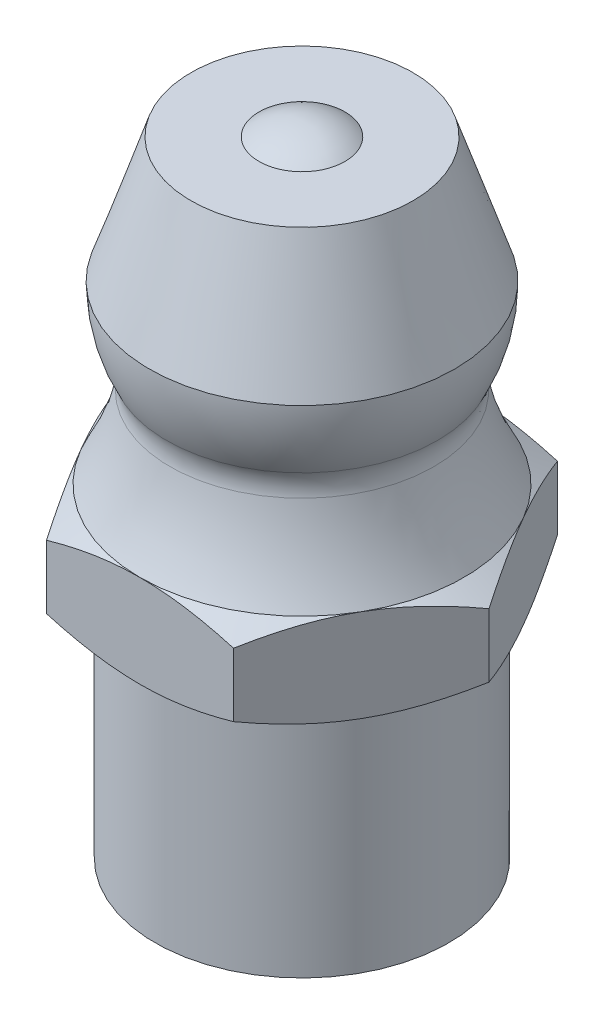
ISO-10303-21;
HEADER;
FILE_DESCRIPTION(('STEP AP214'),'2;1');
FILE_NAME('part.step','',(''),(''),'','','');
FILE_SCHEMA(('AUTOMOTIVE_DESIGN { 1 0 10303 214 1 1 1 1 }'));
ENDSEC;
DATA;
#1=APPLICATION_CONTEXT('core data for automotive mechanical design processes');
#2=APPLICATION_PROTOCOL_DEFINITION('international standard','automotive_design',2000,#1);
#3=PRODUCT_CONTEXT('',#1,'mechanical');
#4=PRODUCT('Part','Part','',(#3));
#5=PRODUCT_RELATED_PRODUCT_CATEGORY('part','',(#4));
#6=PRODUCT_DEFINITION_FORMATION('','',#4);
#7=PRODUCT_DEFINITION_CONTEXT('part definition',#1,'design');
#8=PRODUCT_DEFINITION('design','',#6,#7);
#9=PRODUCT_DEFINITION_SHAPE('','',#8);
#10=(LENGTH_UNIT() NAMED_UNIT(*) SI_UNIT(.MILLI.,.METRE.));
#11=(NAMED_UNIT(*) PLANE_ANGLE_UNIT() SI_UNIT($,.RADIAN.));
#12=(NAMED_UNIT(*) SI_UNIT($,.STERADIAN.) SOLID_ANGLE_UNIT());
#13=UNCERTAINTY_MEASURE_WITH_UNIT(LENGTH_MEASURE(1.E-05),#10,'distance_accuracy_value','');
#14=(GEOMETRIC_REPRESENTATION_CONTEXT(3) GLOBAL_UNCERTAINTY_ASSIGNED_CONTEXT((#13)) GLOBAL_UNIT_ASSIGNED_CONTEXT((#10,
#11,#12)) REPRESENTATION_CONTEXT('',''));
#15=CARTESIAN_POINT('',(0.,0.,0.));
#16=DIRECTION('',(0.,0.,1.));
#17=DIRECTION('',(1.,0.,0.));
#18=AXIS2_PLACEMENT_3D('',#15,#16,#17);
#19=CARTESIAN_POINT('',(0.,56.8,5.));
#20=DIRECTION('',(0.,1.,0.));
#21=DIRECTION('',(0.866025403784439,0.,-0.5));
#22=AXIS2_PLACEMENT_3D('',#19,#20,#21);
#23=PLANE('',#22);
#24=CARTESIAN_POINT('',(0.,56.8,5.));
#25=DIRECTION('',(0.,1.,0.));
#26=DIRECTION('',(0.866025403784439,0.,-0.5));
#27=AXIS2_PLACEMENT_3D('',#24,#25,#26);
#28=CIRCLE('',#27,3.175);
#29=CARTESIAN_POINT('',(-2.7496306570156,56.8,6.5875));
#30=VERTEX_POINT('',#29);
#31=EDGE_CURVE('E218',#30,#30,#28,.T.);
#32=ORIENTED_EDGE('',*,*,#31,.T.);
#33=EDGE_LOOP('',(#32));
#34=FACE_BOUND('',#33,.T.);
#35=CARTESIAN_POINT('',(0.,56.8,5.));
#36=DIRECTION('',(0.,-1.,0.));
#37=DIRECTION('',(-0.866025403784439,0.,0.5));
#38=AXIS2_PLACEMENT_3D('',#35,#36,#37);
#39=CIRCLE('',#38,3.5);
#40=CARTESIAN_POINT('',(0.,56.8,8.5));
#41=VERTEX_POINT('',#40);
#42=CARTESIAN_POINT('',(-3.03108891324554,56.8,6.75));
#43=VERTEX_POINT('',#42);
#44=EDGE_CURVE('E424',#41,#43,#39,.T.);
#45=ORIENTED_EDGE('',*,*,#44,.T.);
#46=CARTESIAN_POINT('',(0.,56.8,5.));
#47=DIRECTION('',(0.,-1.,0.));
#48=DIRECTION('',(-0.866025403784439,0.,0.5));
#49=AXIS2_PLACEMENT_3D('',#46,#47,#48);
#50=CIRCLE('',#49,3.5);
#51=CARTESIAN_POINT('',(-3.03108891324554,56.8,3.25));
#52=VERTEX_POINT('',#51);
#53=EDGE_CURVE('E260',#43,#52,#50,.T.);
#54=ORIENTED_EDGE('',*,*,#53,.T.);
#55=CARTESIAN_POINT('',(0.,56.8,5.));
#56=DIRECTION('',(0.,-1.,0.));
#57=DIRECTION('',(-0.866025403784439,0.,0.5));
#58=AXIS2_PLACEMENT_3D('',#55,#56,#57);
#59=CIRCLE('',#58,3.5);
#60=CARTESIAN_POINT('',(0.,56.8,1.5));
#61=VERTEX_POINT('',#60);
#62=EDGE_CURVE('E269',#52,#61,#59,.T.);
#63=ORIENTED_EDGE('',*,*,#62,.T.);
#64=CARTESIAN_POINT('',(0.,56.8,5.));
#65=DIRECTION('',(0.,-1.,0.));
#66=DIRECTION('',(-0.866025403784439,0.,0.5));
#67=AXIS2_PLACEMENT_3D('',#64,#65,#66);
#68=CIRCLE('',#67,3.5);
#69=CARTESIAN_POINT('',(3.03108891324554,56.8,3.25));
#70=VERTEX_POINT('',#69);
#71=EDGE_CURVE('E287',#61,#70,#68,.T.);
#72=ORIENTED_EDGE('',*,*,#71,.T.);
#73=CARTESIAN_POINT('',(0.,56.8,5.));
#74=DIRECTION('',(0.,-1.,0.));
#75=DIRECTION('',(-0.866025403784439,0.,0.5));
#76=AXIS2_PLACEMENT_3D('',#73,#74,#75);
#77=CIRCLE('',#76,3.5);
#78=CARTESIAN_POINT('',(3.03108891324554,56.8,6.75));
#79=VERTEX_POINT('',#78);
#80=EDGE_CURVE('E351',#70,#79,#77,.T.);
#81=ORIENTED_EDGE('',*,*,#80,.T.);
#82=CARTESIAN_POINT('',(0.,56.8,5.));
#83=DIRECTION('',(0.,-1.,0.));
#84=DIRECTION('',(-0.866025403784439,0.,0.5));
#85=AXIS2_PLACEMENT_3D('',#82,#83,#84);
#86=CIRCLE('',#85,3.5);
#87=EDGE_CURVE('E238',#79,#41,#86,.T.);
#88=ORIENTED_EDGE('',*,*,#87,.T.);
#89=EDGE_LOOP('',(#45,#54,#63,#72,#81,#88));
#90=FACE_BOUND('',#89,.T.);
#91=ADVANCED_FACE('F16',(#34,#90),#23,.F.);
#92=CARTESIAN_POINT('',(2.02072594216369,57.8,8.5));
#93=DIRECTION('',(0.,0.,1.));
#94=DIRECTION('',(-1.,0.,0.));
#95=AXIS2_PLACEMENT_3D('',#92,#93,#94);
#96=PLANE('',#95);
#97=CARTESIAN_POINT('',(0.,56.8,8.5));
#98=CARTESIAN_POINT('',(0.937822173508931,56.8,8.50000000000001));
#99=CARTESIAN_POINT('',(2.02072594216369,57.1126073911697,8.5));
#100=(BOUNDED_CURVE() B_SPLINE_CURVE(2,(#97,#98,#99),.UNSPECIFIED.,.F.,
.F.) B_SPLINE_CURVE_WITH_KNOTS((3,3),(0.442153539432296,0.679746379610025),
.UNSPECIFIED.) CURVE() GEOMETRIC_REPRESENTATION_ITEM() RATIONAL_B_SPLINE_CURVE((1.,
1.0719481240583,1.06657306684152)) REPRESENTATION_ITEM(''));
#101=CARTESIAN_POINT('',(2.02072594216369,57.1126073911697,8.5));
#102=VERTEX_POINT('',#101);
#103=EDGE_CURVE('E217',#41,#102,#100,.T.);
#104=ORIENTED_EDGE('',*,*,#103,.T.);
#105=DIRECTION('',(0.,1.,0.));
#106=VECTOR('',#105,1.);
#107=CARTESIAN_POINT('',(2.02072594216369,57.1126073911697,8.5));
#108=LINE('',#107,#106);
#109=CARTESIAN_POINT('',(2.02072594216369,58.4873926088304,8.5));
#110=VERTEX_POINT('',#109);
#111=EDGE_CURVE('E10',#102,#110,#108,.T.);
#112=ORIENTED_EDGE('',*,*,#111,.T.);
#113=CARTESIAN_POINT('',(2.02072594216369,58.4873926088304,8.5));
#114=CARTESIAN_POINT('',(0.937822173508931,58.8,8.5));
#115=CARTESIAN_POINT('',(0.,58.8,8.5));
#116=(BOUNDED_CURVE() B_SPLINE_CURVE(2,(#113,#114,#115),.UNSPECIFIED.,.F.,
.F.) B_SPLINE_CURVE_WITH_KNOTS((3,3),(0.204560699254567,0.442153539432296),
.UNSPECIFIED.) CURVE() GEOMETRIC_REPRESENTATION_ITEM() RATIONAL_B_SPLINE_CURVE((1.06657306684152,
1.0719481240583,1.)) REPRESENTATION_ITEM(''));
#117=CARTESIAN_POINT('',(0.,58.8,8.5));
#118=VERTEX_POINT('',#117);
#119=EDGE_CURVE('E302',#110,#118,#116,.T.);
#120=ORIENTED_EDGE('',*,*,#119,.T.);
#121=CARTESIAN_POINT('',(0.,58.8,8.5));
#122=CARTESIAN_POINT('',(-0.937822173508929,58.8000000000001,8.50000000000001));
#123=CARTESIAN_POINT('',(-2.02072594216369,58.4873926088304,8.5));
#124=(BOUNDED_CURVE() B_SPLINE_CURVE(2,(#121,#122,#123),.UNSPECIFIED.,.F.,
.F.) B_SPLINE_CURVE_WITH_KNOTS((3,3),(0.442153539432296,0.679746379610025),
.UNSPECIFIED.) CURVE() GEOMETRIC_REPRESENTATION_ITEM() RATIONAL_B_SPLINE_CURVE((1.,
1.0719481240583,1.06657306684152)) REPRESENTATION_ITEM(''));
#125=CARTESIAN_POINT('',(-2.02072594216369,58.4873926088304,8.5));
#126=VERTEX_POINT('',#125);
#127=EDGE_CURVE('E307',#118,#126,#124,.T.);
#128=ORIENTED_EDGE('',*,*,#127,.T.);
#129=DIRECTION('',(0.,-1.,0.));
#130=VECTOR('',#129,1.);
#131=CARTESIAN_POINT('',(-2.02072594216369,58.4873926088304,8.5));
#132=LINE('',#131,#130);
#133=CARTESIAN_POINT('',(-2.02072594216369,57.1126073911696,8.5));
#134=VERTEX_POINT('',#133);
#135=EDGE_CURVE('E230',#126,#134,#132,.T.);
#136=ORIENTED_EDGE('',*,*,#135,.T.);
#137=CARTESIAN_POINT('',(-2.02072594216369,57.1126073911697,8.50000000000001));
#138=CARTESIAN_POINT('',(-0.937822173508931,56.8,8.50000000000002));
#139=CARTESIAN_POINT('',(0.,56.8,8.5));
#140=(BOUNDED_CURVE() B_SPLINE_CURVE(2,(#137,#138,#139),.UNSPECIFIED.,.F.,
.F.) B_SPLINE_CURVE_WITH_KNOTS((3,3),(0.204560699254567,0.442153539432296),
.UNSPECIFIED.) CURVE() GEOMETRIC_REPRESENTATION_ITEM() RATIONAL_B_SPLINE_CURVE((1.06657306684152,
1.0719481240583,1.)) REPRESENTATION_ITEM(''));
#141=EDGE_CURVE('E237',#134,#41,#140,.T.);
#142=ORIENTED_EDGE('',*,*,#141,.T.);
#143=EDGE_LOOP('',(#104,#112,#120,#128,#136,#142));
#144=FACE_BOUND('',#143,.T.);
#145=ADVANCED_FACE('F416',(#144),#96,.T.);
#146=CARTESIAN_POINT('',(4.04145188432738,57.8,5.));
#147=DIRECTION('',(0.866025403784439,0.,0.5));
#148=DIRECTION('',(0.,-1.,0.));
#149=AXIS2_PLACEMENT_3D('',#146,#147,#148);
#150=PLANE('',#149);
#151=CARTESIAN_POINT('',(3.03108891324554,56.8,6.75));
#152=CARTESIAN_POINT('',(3.50000000000001,56.8,5.93782217350894));
#153=CARTESIAN_POINT('',(4.04145188432739,57.1126073911696,5.));
#154=(BOUNDED_CURVE() B_SPLINE_CURVE(2,(#151,#152,#153),.UNSPECIFIED.,.F.,
.F.) B_SPLINE_CURVE_WITH_KNOTS((3,3),(0.442153539432296,0.679746379610025),
.UNSPECIFIED.) CURVE() GEOMETRIC_REPRESENTATION_ITEM() RATIONAL_B_SPLINE_CURVE((1.,
1.0719481240583,1.06657306684152)) REPRESENTATION_ITEM(''));
#155=CARTESIAN_POINT('',(4.04145188432738,57.1126073911697,5.));
#156=VERTEX_POINT('',#155);
#157=EDGE_CURVE('E406',#79,#156,#154,.T.);
#158=ORIENTED_EDGE('',*,*,#157,.T.);
#159=DIRECTION('',(0.,-1.,0.));
#160=VECTOR('',#159,1.);
#161=CARTESIAN_POINT('',(4.04145188432738,58.4873926088304,5.));
#162=LINE('',#161,#160);
#163=CARTESIAN_POINT('',(4.04145188432738,58.4873926088304,5.));
#164=VERTEX_POINT('',#163);
#165=EDGE_CURVE('E28',#164,#156,#162,.T.);
#166=ORIENTED_EDGE('',*,*,#165,.F.);
#167=CARTESIAN_POINT('',(4.04145188432739,58.4873926088304,5.));
#168=CARTESIAN_POINT('',(3.50000000000001,58.8,5.93782217350893));
#169=CARTESIAN_POINT('',(3.03108891324554,58.8,6.75));
#170=(BOUNDED_CURVE() B_SPLINE_CURVE(2,(#167,#168,#169),.UNSPECIFIED.,.F.,
.F.) B_SPLINE_CURVE_WITH_KNOTS((3,3),(0.204560699254567,0.442153539432296),
.UNSPECIFIED.) CURVE() GEOMETRIC_REPRESENTATION_ITEM() RATIONAL_B_SPLINE_CURVE((1.06657306684152,
1.0719481240583,1.)) REPRESENTATION_ITEM(''));
#171=CARTESIAN_POINT('',(3.03108891324554,58.8,6.75));
#172=VERTEX_POINT('',#171);
#173=EDGE_CURVE('E248',#164,#172,#170,.T.);
#174=ORIENTED_EDGE('',*,*,#173,.T.);
#175=CARTESIAN_POINT('',(3.03108891324554,58.8,6.75));
#176=CARTESIAN_POINT('',(2.56217782649107,58.8000000000001,7.56217782649107));
#177=CARTESIAN_POINT('',(2.02072594216369,58.4873926088304,8.5));
#178=(BOUNDED_CURVE() B_SPLINE_CURVE(2,(#175,#176,#177),.UNSPECIFIED.,.F.,
.F.) B_SPLINE_CURVE_WITH_KNOTS((3,3),(0.442153539432296,0.679746379610025),
.UNSPECIFIED.) CURVE() GEOMETRIC_REPRESENTATION_ITEM() RATIONAL_B_SPLINE_CURVE((1.,
1.0719481240583,1.06657306684152)) REPRESENTATION_ITEM(''));
#179=EDGE_CURVE('E308',#172,#110,#178,.T.);
#180=ORIENTED_EDGE('',*,*,#179,.T.);
#181=ORIENTED_EDGE('',*,*,#111,.F.);
#182=CARTESIAN_POINT('',(2.02072594216369,57.1126073911696,8.50000000000001));
#183=CARTESIAN_POINT('',(2.56217782649107,56.8,7.56217782649109));
#184=CARTESIAN_POINT('',(3.03108891324554,56.8,6.75));
#185=(BOUNDED_CURVE() B_SPLINE_CURVE(2,(#182,#183,#184),.UNSPECIFIED.,.F.,
.F.) B_SPLINE_CURVE_WITH_KNOTS((3,3),(0.204560699254567,0.442153539432296),
.UNSPECIFIED.) CURVE() GEOMETRIC_REPRESENTATION_ITEM() RATIONAL_B_SPLINE_CURVE((1.06657306684152,
1.0719481240583,1.)) REPRESENTATION_ITEM(''));
#186=EDGE_CURVE('E212',#102,#79,#185,.T.);
#187=ORIENTED_EDGE('',*,*,#186,.T.);
#188=EDGE_LOOP('',(#158,#166,#174,#180,#181,#187));
#189=FACE_BOUND('',#188,.T.);
#190=ADVANCED_FACE('F415',(#189),#150,.T.);
#191=CARTESIAN_POINT('',(2.02072594216369,57.8,1.5));
#192=DIRECTION('',(0.866025403784439,0.,-0.5));
#193=DIRECTION('',(-0.5,0.,-0.866025403784439));
#194=AXIS2_PLACEMENT_3D('',#191,#192,#193);
#195=PLANE('',#194);
#196=CARTESIAN_POINT('',(3.03108891324554,56.8,3.25));
#197=CARTESIAN_POINT('',(2.56217782649107,56.8,2.43782217350893));
#198=CARTESIAN_POINT('',(2.02072594216369,57.1126073911696,1.5));
#199=(BOUNDED_CURVE() B_SPLINE_CURVE(2,(#196,#197,#198),.UNSPECIFIED.,.F.,
.F.) B_SPLINE_CURVE_WITH_KNOTS((3,3),(0.442153539432296,0.679746379610025),
.UNSPECIFIED.) CURVE() GEOMETRIC_REPRESENTATION_ITEM() RATIONAL_B_SPLINE_CURVE((1.,
1.07194812405831,1.06657306684152)) REPRESENTATION_ITEM(''));
#200=CARTESIAN_POINT('',(2.02072594216369,57.1126073911696,1.5));
#201=VERTEX_POINT('',#200);
#202=EDGE_CURVE('E314',#70,#201,#199,.T.);
#203=ORIENTED_EDGE('',*,*,#202,.T.);
#204=DIRECTION('',(0.,-1.,0.));
#205=VECTOR('',#204,1.);
#206=CARTESIAN_POINT('',(2.02072594216369,58.4873926088304,1.5));
#207=LINE('',#206,#205);
#208=CARTESIAN_POINT('',(2.02072594216369,58.4873926088304,1.5));
#209=VERTEX_POINT('',#208);
#210=EDGE_CURVE('E169',#209,#201,#207,.T.);
#211=ORIENTED_EDGE('',*,*,#210,.F.);
#212=CARTESIAN_POINT('',(2.02072594216369,58.4873926088304,1.5));
#213=CARTESIAN_POINT('',(2.56217782649107,58.8,2.43782217350893));
#214=CARTESIAN_POINT('',(3.03108891324554,58.8,3.25));
#215=(BOUNDED_CURVE() B_SPLINE_CURVE(2,(#212,#213,#214),.UNSPECIFIED.,.F.,
.F.) B_SPLINE_CURVE_WITH_KNOTS((3,3),(0.204560699254566,0.442153539432296),
.UNSPECIFIED.) CURVE() GEOMETRIC_REPRESENTATION_ITEM() RATIONAL_B_SPLINE_CURVE((1.06657306684152,
1.07194812405831,1.)) REPRESENTATION_ITEM(''));
#216=CARTESIAN_POINT('',(3.03108891324554,58.8,3.25));
#217=VERTEX_POINT('',#216);
#218=EDGE_CURVE('E19',#209,#217,#215,.T.);
#219=ORIENTED_EDGE('',*,*,#218,.T.);
#220=CARTESIAN_POINT('',(3.03108891324554,58.8,3.25));
#221=CARTESIAN_POINT('',(3.5,58.8,4.06217782649107));
#222=CARTESIAN_POINT('',(4.04145188432739,58.4873926088304,5.));
#223=(BOUNDED_CURVE() B_SPLINE_CURVE(2,(#220,#221,#222),.UNSPECIFIED.,.F.,
.F.) B_SPLINE_CURVE_WITH_KNOTS((3,3),(0.442153539432296,0.679746379610025),
.UNSPECIFIED.) CURVE() GEOMETRIC_REPRESENTATION_ITEM() RATIONAL_B_SPLINE_CURVE((1.,
1.07194812405831,1.06657306684152)) REPRESENTATION_ITEM(''));
#224=EDGE_CURVE('E243',#217,#164,#223,.T.);
#225=ORIENTED_EDGE('',*,*,#224,.T.);
#226=ORIENTED_EDGE('',*,*,#165,.T.);
#227=CARTESIAN_POINT('',(4.04145188432739,57.1126073911696,5.));
#228=CARTESIAN_POINT('',(3.5,56.8,4.06217782649107));
#229=CARTESIAN_POINT('',(3.03108891324554,56.8,3.25));
#230=(BOUNDED_CURVE() B_SPLINE_CURVE(2,(#227,#228,#229),.UNSPECIFIED.,.F.,
.F.) B_SPLINE_CURVE_WITH_KNOTS((3,3),(0.204560699254566,0.442153539432296),
.UNSPECIFIED.) CURVE() GEOMETRIC_REPRESENTATION_ITEM() RATIONAL_B_SPLINE_CURVE((1.06657306684152,
1.07194812405831,1.)) REPRESENTATION_ITEM(''));
#231=EDGE_CURVE('E242',#156,#70,#230,.T.);
#232=ORIENTED_EDGE('',*,*,#231,.T.);
#233=EDGE_LOOP('',(#203,#211,#219,#225,#226,#232));
#234=FACE_BOUND('',#233,.T.);
#235=ADVANCED_FACE('F393',(#234),#195,.T.);
#236=CARTESIAN_POINT('',(0.,58.2226497308104,5.));
#237=DIRECTION('',(0.,-1.,0.));
#238=DIRECTION('',(-0.866025403784439,0.,0.5));
#239=AXIS2_PLACEMENT_3D('',#236,#237,#238);
#240=CONICAL_SURFACE('',#239,4.5,1.04719755);
#241=ORIENTED_EDGE('',*,*,#127,.F.);
#242=CARTESIAN_POINT('',(0.,58.8,5.));
#243=DIRECTION('',(0.,1.,0.));
#244=DIRECTION('',(-0.866025403784439,0.,0.5));
#245=AXIS2_PLACEMENT_3D('',#242,#243,#244);
#246=CIRCLE('',#245,3.5);
#247=CARTESIAN_POINT('',(-3.03108891324554,58.8,6.75));
#248=VERTEX_POINT('',#247);
#249=EDGE_CURVE('E204',#248,#118,#246,.T.);
#250=ORIENTED_EDGE('',*,*,#249,.F.);
#251=CARTESIAN_POINT('',(-2.02072594216369,58.4873926088304,8.50000000000001));
#252=CARTESIAN_POINT('',(-2.56217782649107,58.8000000000001,7.56217782649108));
#253=CARTESIAN_POINT('',(-3.03108891324554,58.8,6.75));
#254=(BOUNDED_CURVE() B_SPLINE_CURVE(2,(#251,#252,#253),.UNSPECIFIED.,.F.,
.F.) B_SPLINE_CURVE_WITH_KNOTS((3,3),(0.204560699254567,0.442153539432296),
.UNSPECIFIED.) CURVE() GEOMETRIC_REPRESENTATION_ITEM() RATIONAL_B_SPLINE_CURVE((1.06657306684152,
1.07194812405831,1.)) REPRESENTATION_ITEM(''));
#255=EDGE_CURVE('E293',#126,#248,#254,.T.);
#256=ORIENTED_EDGE('',*,*,#255,.F.);
#257=EDGE_LOOP('',(#241,#250,#256));
#258=FACE_BOUND('',#257,.T.);
#259=ADVANCED_FACE('F471',(#258),#240,.T.);
#260=CARTESIAN_POINT('',(0.,58.2226497308104,5.));
#261=DIRECTION('',(0.,-1.,0.));
#262=DIRECTION('',(-0.866025403784439,0.,0.5));
#263=AXIS2_PLACEMENT_3D('',#260,#261,#262);
#264=CONICAL_SURFACE('',#263,4.5,1.04719755);
#265=ORIENTED_EDGE('',*,*,#179,.F.);
#266=CARTESIAN_POINT('',(0.,58.8,5.));
#267=DIRECTION('',(0.,1.,0.));
#268=DIRECTION('',(-0.866025403784439,0.,0.5));
#269=AXIS2_PLACEMENT_3D('',#266,#267,#268);
#270=CIRCLE('',#269,3.5);
#271=EDGE_CURVE('E225',#118,#172,#270,.T.);
#272=ORIENTED_EDGE('',*,*,#271,.F.);
#273=ORIENTED_EDGE('',*,*,#119,.F.);
#274=EDGE_LOOP('',(#265,#272,#273));
#275=FACE_BOUND('',#274,.T.);
#276=ADVANCED_FACE('F475',(#275),#264,.T.);
#277=CARTESIAN_POINT('',(0.,58.2226497308104,5.));
#278=DIRECTION('',(0.,-1.,0.));
#279=DIRECTION('',(-0.866025403784439,0.,0.5));
#280=AXIS2_PLACEMENT_3D('',#277,#278,#279);
#281=CONICAL_SURFACE('',#280,4.5,1.04719755);
#282=ORIENTED_EDGE('',*,*,#224,.F.);
#283=CARTESIAN_POINT('',(0.,58.8,5.));
#284=DIRECTION('',(0.,1.,0.));
#285=DIRECTION('',(-0.866025403784439,0.,0.5));
#286=AXIS2_PLACEMENT_3D('',#283,#284,#285);
#287=CIRCLE('',#286,3.5);
#288=EDGE_CURVE('E189',#172,#217,#287,.T.);
#289=ORIENTED_EDGE('',*,*,#288,.F.);
#290=ORIENTED_EDGE('',*,*,#173,.F.);
#291=EDGE_LOOP('',(#282,#289,#290));
#292=FACE_BOUND('',#291,.T.);
#293=ADVANCED_FACE('F478',(#292),#281,.T.);
#294=CARTESIAN_POINT('',(0.,58.2226497308104,5.));
#295=DIRECTION('',(0.,-1.,0.));
#296=DIRECTION('',(-0.866025403784439,0.,0.5));
#297=AXIS2_PLACEMENT_3D('',#294,#295,#296);
#298=CONICAL_SURFACE('',#297,4.5,1.04719755);
#299=ORIENTED_EDGE('',*,*,#218,.F.);
#300=CARTESIAN_POINT('',(0.,58.8,1.5));
#301=CARTESIAN_POINT('',(0.937822173508931,58.8,1.5));
#302=CARTESIAN_POINT('',(2.02072594216369,58.4873926088304,1.5));
#303=(BOUNDED_CURVE() B_SPLINE_CURVE(2,(#300,#301,#302),.UNSPECIFIED.,.F.,
.F.) B_SPLINE_CURVE_WITH_KNOTS((3,3),(0.442153539432296,0.679746379610025),
.UNSPECIFIED.) CURVE() GEOMETRIC_REPRESENTATION_ITEM() RATIONAL_B_SPLINE_CURVE((1.,
1.0719481240583,1.06657306684152)) REPRESENTATION_ITEM(''));
#304=CARTESIAN_POINT('',(0.,58.8,1.5));
#305=VERTEX_POINT('',#304);
#306=EDGE_CURVE('E159',#305,#209,#303,.T.);
#307=ORIENTED_EDGE('',*,*,#306,.F.);
#308=CARTESIAN_POINT('',(0.,58.8,5.));
#309=DIRECTION('',(0.,1.,0.));
#310=DIRECTION('',(-0.866025403784439,0.,0.5));
#311=AXIS2_PLACEMENT_3D('',#308,#309,#310);
#312=CIRCLE('',#311,3.5);
#313=EDGE_CURVE('E163',#217,#305,#312,.T.);
#314=ORIENTED_EDGE('',*,*,#313,.F.);
#315=EDGE_LOOP('',(#299,#307,#314));
#316=FACE_BOUND('',#315,.T.);
#317=ADVANCED_FACE('F161',(#316),#298,.T.);
#318=CARTESIAN_POINT('',(0.,58.2226497308104,5.));
#319=DIRECTION('',(0.,-1.,0.));
#320=DIRECTION('',(-0.866025403784439,0.,0.5));
#321=AXIS2_PLACEMENT_3D('',#318,#319,#320);
#322=CONICAL_SURFACE('',#321,4.5,1.04719755);
#323=CARTESIAN_POINT('',(-2.02072594216369,58.4873926088304,1.5));
#324=CARTESIAN_POINT('',(-0.93782217350893,58.8,1.5));
#325=CARTESIAN_POINT('',(0.,58.8,1.5));
#326=(BOUNDED_CURVE() B_SPLINE_CURVE(2,(#323,#324,#325),.UNSPECIFIED.,.F.,
.F.) B_SPLINE_CURVE_WITH_KNOTS((3,3),(0.204560699254567,0.442153539432296),
.UNSPECIFIED.) CURVE() GEOMETRIC_REPRESENTATION_ITEM() RATIONAL_B_SPLINE_CURVE((1.06657306684153,
1.07194812405831,1.)) REPRESENTATION_ITEM(''));
#327=CARTESIAN_POINT('',(-2.02072594216369,58.4873926088304,1.5));
#328=VERTEX_POINT('',#327);
#329=EDGE_CURVE('E170',#328,#305,#326,.T.);
#330=ORIENTED_EDGE('',*,*,#329,.F.);
#331=CARTESIAN_POINT('',(-3.03108891324554,58.8,3.25));
#332=CARTESIAN_POINT('',(-2.56217782649107,58.8,2.43782217350893));
#333=CARTESIAN_POINT('',(-2.02072594216369,58.4873926088304,1.5));
#334=(BOUNDED_CURVE() B_SPLINE_CURVE(2,(#331,#332,#333),.UNSPECIFIED.,.F.,
.F.) B_SPLINE_CURVE_WITH_KNOTS((3,3),(0.442153539432296,0.679746379610025),
.UNSPECIFIED.) CURVE() GEOMETRIC_REPRESENTATION_ITEM() RATIONAL_B_SPLINE_CURVE((1.,
1.0719481240583,1.06657306684152)) REPRESENTATION_ITEM(''));
#335=CARTESIAN_POINT('',(-3.03108891324554,58.8,3.25));
#336=VERTEX_POINT('',#335);
#337=EDGE_CURVE('E194',#336,#328,#334,.T.);
#338=ORIENTED_EDGE('',*,*,#337,.F.);
#339=CARTESIAN_POINT('',(0.,58.8,5.));
#340=DIRECTION('',(0.,1.,0.));
#341=DIRECTION('',(-0.866025403784439,0.,0.5));
#342=AXIS2_PLACEMENT_3D('',#339,#340,#341);
#343=CIRCLE('',#342,3.5);
#344=EDGE_CURVE('E186',#305,#336,#343,.T.);
#345=ORIENTED_EDGE('',*,*,#344,.F.);
#346=EDGE_LOOP('',(#330,#338,#345));
#347=FACE_BOUND('',#346,.T.);
#348=ADVANCED_FACE('F193',(#347),#322,.T.);
#349=CARTESIAN_POINT('',(0.,58.2226497308104,5.));
#350=DIRECTION('',(0.,-1.,0.));
#351=DIRECTION('',(-0.866025403784439,0.,0.5));
#352=AXIS2_PLACEMENT_3D('',#349,#350,#351);
#353=CONICAL_SURFACE('',#352,4.5,1.04719755);
#354=CARTESIAN_POINT('',(-4.04145188432738,58.4873926088304,5.));
#355=CARTESIAN_POINT('',(-3.5,58.8,4.06217782649107));
#356=CARTESIAN_POINT('',(-3.03108891324554,58.8,3.25));
#357=(BOUNDED_CURVE() B_SPLINE_CURVE(2,(#354,#355,#356),.UNSPECIFIED.,.F.,
.F.) B_SPLINE_CURVE_WITH_KNOTS((3,3),(0.204560699254567,0.442153539432296),
.UNSPECIFIED.) CURVE() GEOMETRIC_REPRESENTATION_ITEM() RATIONAL_B_SPLINE_CURVE((1.06657306684152,
1.07194812405831,1.)) REPRESENTATION_ITEM(''));
#358=CARTESIAN_POINT('',(-4.04145188432738,58.4873926088304,5.));
#359=VERTEX_POINT('',#358);
#360=EDGE_CURVE('E231',#359,#336,#357,.T.);
#361=ORIENTED_EDGE('',*,*,#360,.F.);
#362=CARTESIAN_POINT('',(-3.03108891324554,58.8,6.75));
#363=CARTESIAN_POINT('',(-3.5,58.8,5.93782217350893));
#364=CARTESIAN_POINT('',(-4.04145188432738,58.4873926088304,5.));
#365=(BOUNDED_CURVE() B_SPLINE_CURVE(2,(#362,#363,#364),.UNSPECIFIED.,.F.,
.F.) B_SPLINE_CURVE_WITH_KNOTS((3,3),(0.442153539432296,0.679746379610026),
.UNSPECIFIED.) CURVE() GEOMETRIC_REPRESENTATION_ITEM() RATIONAL_B_SPLINE_CURVE((1.,
1.07194812405831,1.06657306684152)) REPRESENTATION_ITEM(''));
#366=EDGE_CURVE('E328',#248,#359,#365,.T.);
#367=ORIENTED_EDGE('',*,*,#366,.F.);
#368=CARTESIAN_POINT('',(0.,58.8,5.));
#369=DIRECTION('',(0.,1.,0.));
#370=DIRECTION('',(-0.866025403784439,0.,0.5));
#371=AXIS2_PLACEMENT_3D('',#368,#369,#370);
#372=CIRCLE('',#371,3.5);
#373=EDGE_CURVE('E197',#336,#248,#372,.T.);
#374=ORIENTED_EDGE('',*,*,#373,.F.);
#375=EDGE_LOOP('',(#361,#367,#374));
#376=FACE_BOUND('',#375,.T.);
#377=ADVANCED_FACE('F466',(#376),#353,.T.);
#378=CARTESIAN_POINT('',(-2.02072594216369,57.8,8.5));
#379=DIRECTION('',(-0.866025403784439,0.,0.5));
#380=DIRECTION('',(0.,1.,0.));
#381=AXIS2_PLACEMENT_3D('',#378,#379,#380);
#382=PLANE('',#381);
#383=CARTESIAN_POINT('',(-4.04145188432738,57.1126073911696,5.));
#384=CARTESIAN_POINT('',(-3.5,56.8,5.93782217350893));
#385=CARTESIAN_POINT('',(-3.03108891324554,56.8,6.75));
#386=(BOUNDED_CURVE() B_SPLINE_CURVE(2,(#383,#384,#385),.UNSPECIFIED.,.F.,
.F.) B_SPLINE_CURVE_WITH_KNOTS((3,3),(0.204560699254567,0.442153539432295),
.UNSPECIFIED.) CURVE() GEOMETRIC_REPRESENTATION_ITEM() RATIONAL_B_SPLINE_CURVE((1.06657306684152,
1.07194812405831,1.)) REPRESENTATION_ITEM(''));
#387=CARTESIAN_POINT('',(-4.04145188432738,57.1126073911696,5.));
#388=VERTEX_POINT('',#387);
#389=EDGE_CURVE('E433',#388,#43,#386,.T.);
#390=ORIENTED_EDGE('',*,*,#389,.T.);
#391=CARTESIAN_POINT('',(-3.03108891324554,56.8,6.75));
#392=CARTESIAN_POINT('',(-2.56217782649107,56.8,7.56217782649108));
#393=CARTESIAN_POINT('',(-2.02072594216369,57.1126073911697,8.50000000000001));
#394=(BOUNDED_CURVE() B_SPLINE_CURVE(2,(#391,#392,#393),.UNSPECIFIED.,.F.,
.F.) B_SPLINE_CURVE_WITH_KNOTS((3,3),(0.442153539432296,0.679746379610026),
.UNSPECIFIED.) CURVE() GEOMETRIC_REPRESENTATION_ITEM() RATIONAL_B_SPLINE_CURVE((1.,
1.07194812405831,1.06657306684152)) REPRESENTATION_ITEM(''));
#395=EDGE_CURVE('E427',#43,#134,#394,.T.);
#396=ORIENTED_EDGE('',*,*,#395,.T.);
#397=ORIENTED_EDGE('',*,*,#135,.F.);
#398=ORIENTED_EDGE('',*,*,#255,.T.);
#399=ORIENTED_EDGE('',*,*,#366,.T.);
#400=DIRECTION('',(0.,-1.,0.));
#401=VECTOR('',#400,1.);
#402=CARTESIAN_POINT('',(-4.04145188432738,58.4873926088304,5.));
#403=LINE('',#402,#401);
#404=EDGE_CURVE('E298',#359,#388,#403,.T.);
#405=ORIENTED_EDGE('',*,*,#404,.T.);
#406=EDGE_LOOP('',(#390,#396,#397,#398,#399,#405));
#407=FACE_BOUND('',#406,.T.);
#408=ADVANCED_FACE('F513',(#407),#382,.T.);
#409=CARTESIAN_POINT('',(-4.04145188432738,57.8,5.));
#410=DIRECTION('',(-0.866025403784439,0.,-0.5));
#411=DIRECTION('',(0.,1.,0.));
#412=AXIS2_PLACEMENT_3D('',#409,#410,#411);
#413=PLANE('',#412);
#414=CARTESIAN_POINT('',(-2.02072594216369,57.1126073911697,1.5));
#415=CARTESIAN_POINT('',(-2.56217782649107,56.8,2.43782217350894));
#416=CARTESIAN_POINT('',(-3.03108891324554,56.8,3.25));
#417=(BOUNDED_CURVE() B_SPLINE_CURVE(2,(#414,#415,#416),.UNSPECIFIED.,.F.,
.F.) B_SPLINE_CURVE_WITH_KNOTS((3,3),(0.204560699254567,0.442153539432296),
.UNSPECIFIED.) CURVE() GEOMETRIC_REPRESENTATION_ITEM() RATIONAL_B_SPLINE_CURVE((1.06657306684152,
1.0719481240583,1.)) REPRESENTATION_ITEM(''));
#418=CARTESIAN_POINT('',(-2.02072594216369,57.1126073911696,1.5));
#419=VERTEX_POINT('',#418);
#420=EDGE_CURVE('E261',#419,#52,#417,.T.);
#421=ORIENTED_EDGE('',*,*,#420,.T.);
#422=CARTESIAN_POINT('',(-3.03108891324554,56.8,3.25));
#423=CARTESIAN_POINT('',(-3.5,56.8,4.06217782649108));
#424=CARTESIAN_POINT('',(-4.04145188432738,57.1126073911696,5.));
#425=(BOUNDED_CURVE() B_SPLINE_CURVE(2,(#422,#423,#424),.UNSPECIFIED.,.F.,
.F.) B_SPLINE_CURVE_WITH_KNOTS((3,3),(0.442153539432297,0.679746379610025),
.UNSPECIFIED.) CURVE() GEOMETRIC_REPRESENTATION_ITEM() RATIONAL_B_SPLINE_CURVE((1.,
1.07194812405831,1.06657306684152)) REPRESENTATION_ITEM(''));
#426=EDGE_CURVE('E255',#52,#388,#425,.T.);
#427=ORIENTED_EDGE('',*,*,#426,.T.);
#428=ORIENTED_EDGE('',*,*,#404,.F.);
#429=ORIENTED_EDGE('',*,*,#360,.T.);
#430=ORIENTED_EDGE('',*,*,#337,.T.);
#431=DIRECTION('',(0.,-1.,0.));
#432=VECTOR('',#431,1.);
#433=CARTESIAN_POINT('',(-2.02072594216369,58.4873926088304,1.5));
#434=LINE('',#433,#432);
#435=EDGE_CURVE('E177',#328,#419,#434,.T.);
#436=ORIENTED_EDGE('',*,*,#435,.T.);
#437=EDGE_LOOP('',(#421,#427,#428,#429,#430,#436));
#438=FACE_BOUND('',#437,.T.);
#439=ADVANCED_FACE('F464',(#438),#413,.T.);
#440=CARTESIAN_POINT('',(-2.02072594216369,57.8,1.5));
#441=DIRECTION('',(0.,0.,-1.));
#442=DIRECTION('',(0.,-1.,0.));
#443=AXIS2_PLACEMENT_3D('',#440,#441,#442);
#444=PLANE('',#443);
#445=CARTESIAN_POINT('',(2.02072594216369,57.1126073911697,1.5));
#446=CARTESIAN_POINT('',(0.937822173508931,56.8,1.5));
#447=CARTESIAN_POINT('',(0.,56.8,1.5));
#448=(BOUNDED_CURVE() B_SPLINE_CURVE(2,(#445,#446,#447),.UNSPECIFIED.,.F.,
.F.) B_SPLINE_CURVE_WITH_KNOTS((3,3),(0.204560699254567,0.442153539432296),
.UNSPECIFIED.) CURVE() GEOMETRIC_REPRESENTATION_ITEM() RATIONAL_B_SPLINE_CURVE((1.06657306684152,
1.0719481240583,1.)) REPRESENTATION_ITEM(''));
#449=EDGE_CURVE('E347',#201,#61,#448,.T.);
#450=ORIENTED_EDGE('',*,*,#449,.T.);
#451=CARTESIAN_POINT('',(0.,56.8,1.5));
#452=CARTESIAN_POINT('',(-0.93782217350893,56.8,1.5));
#453=CARTESIAN_POINT('',(-2.02072594216369,57.1126073911696,1.5));
#454=(BOUNDED_CURVE() B_SPLINE_CURVE(2,(#451,#452,#453),.UNSPECIFIED.,.F.,
.F.) B_SPLINE_CURVE_WITH_KNOTS((3,3),(0.442153539432296,0.679746379610025),
.UNSPECIFIED.) CURVE() GEOMETRIC_REPRESENTATION_ITEM() RATIONAL_B_SPLINE_CURVE((1.,
1.07194812405831,1.06657306684153)) REPRESENTATION_ITEM(''));
#455=EDGE_CURVE('E279',#61,#419,#454,.T.);
#456=ORIENTED_EDGE('',*,*,#455,.T.);
#457=ORIENTED_EDGE('',*,*,#435,.F.);
#458=ORIENTED_EDGE('',*,*,#329,.T.);
#459=ORIENTED_EDGE('',*,*,#306,.T.);
#460=ORIENTED_EDGE('',*,*,#210,.T.);
#461=EDGE_LOOP('',(#450,#456,#457,#458,#459,#460));
#462=FACE_BOUND('',#461,.T.);
#463=ADVANCED_FACE('F175',(#462),#444,.T.);
#464=CARTESIAN_POINT('',(0.,57.3773502691896,5.));
#465=DIRECTION('',(0.,1.,0.));
#466=DIRECTION('',(-0.866025403784439,0.,0.5));
#467=AXIS2_PLACEMENT_3D('',#464,#465,#466);
#468=CONICAL_SURFACE('',#467,4.5,1.04719755);
#469=ORIENTED_EDGE('',*,*,#395,.F.);
#470=ORIENTED_EDGE('',*,*,#44,.F.);
#471=ORIENTED_EDGE('',*,*,#141,.F.);
#472=EDGE_LOOP('',(#469,#470,#471));
#473=FACE_BOUND('',#472,.T.);
#474=ADVANCED_FACE('F426',(#473),#468,.T.);
#475=CARTESIAN_POINT('',(0.,57.3773502691896,5.));
#476=DIRECTION('',(0.,1.,0.));
#477=DIRECTION('',(-0.866025403784439,0.,0.5));
#478=AXIS2_PLACEMENT_3D('',#475,#476,#477);
#479=CONICAL_SURFACE('',#478,4.5,1.04719755);
#480=ORIENTED_EDGE('',*,*,#426,.F.);
#481=ORIENTED_EDGE('',*,*,#53,.F.);
#482=ORIENTED_EDGE('',*,*,#389,.F.);
#483=EDGE_LOOP('',(#480,#481,#482));
#484=FACE_BOUND('',#483,.T.);
#485=ADVANCED_FACE('F516',(#484),#479,.T.);
#486=CARTESIAN_POINT('',(0.,57.3773502691896,5.));
#487=DIRECTION('',(0.,1.,0.));
#488=DIRECTION('',(-0.866025403784439,0.,0.5));
#489=AXIS2_PLACEMENT_3D('',#486,#487,#488);
#490=CONICAL_SURFACE('',#489,4.5,1.04719755);
#491=ORIENTED_EDGE('',*,*,#455,.F.);
#492=ORIENTED_EDGE('',*,*,#62,.F.);
#493=ORIENTED_EDGE('',*,*,#420,.F.);
#494=EDGE_LOOP('',(#491,#492,#493));
#495=FACE_BOUND('',#494,.T.);
#496=ADVANCED_FACE('F559',(#495),#490,.T.);
#497=CARTESIAN_POINT('',(0.,57.3773502691896,5.));
#498=DIRECTION('',(0.,1.,0.));
#499=DIRECTION('',(-0.866025403784439,0.,0.5));
#500=AXIS2_PLACEMENT_3D('',#497,#498,#499);
#501=CONICAL_SURFACE('',#500,4.5,1.04719755);
#502=ORIENTED_EDGE('',*,*,#449,.F.);
#503=ORIENTED_EDGE('',*,*,#202,.F.);
#504=ORIENTED_EDGE('',*,*,#71,.F.);
#505=EDGE_LOOP('',(#502,#503,#504));
#506=FACE_BOUND('',#505,.T.);
#507=ADVANCED_FACE('F400',(#506),#501,.T.);
#508=CARTESIAN_POINT('',(0.,57.3773502691896,5.));
#509=DIRECTION('',(0.,1.,0.));
#510=DIRECTION('',(-0.866025403784439,0.,0.5));
#511=AXIS2_PLACEMENT_3D('',#508,#509,#510);
#512=CONICAL_SURFACE('',#511,4.5,1.04719755);
#513=ORIENTED_EDGE('',*,*,#231,.F.);
#514=ORIENTED_EDGE('',*,*,#157,.F.);
#515=ORIENTED_EDGE('',*,*,#80,.F.);
#516=EDGE_LOOP('',(#513,#514,#515));
#517=FACE_BOUND('',#516,.T.);
#518=ADVANCED_FACE('F409',(#517),#512,.T.);
#519=CARTESIAN_POINT('',(0.,57.3773502691896,5.));
#520=DIRECTION('',(0.,1.,0.));
#521=DIRECTION('',(-0.866025403784439,0.,0.5));
#522=AXIS2_PLACEMENT_3D('',#519,#520,#521);
#523=CONICAL_SURFACE('',#522,4.5,1.04719755);
#524=ORIENTED_EDGE('',*,*,#186,.F.);
#525=ORIENTED_EDGE('',*,*,#103,.F.);
#526=ORIENTED_EDGE('',*,*,#87,.F.);
#527=EDGE_LOOP('',(#524,#525,#526));
#528=FACE_BOUND('',#527,.T.);
#529=ADVANCED_FACE('F414',(#528),#523,.T.);
#530=CARTESIAN_POINT('',(0.,51.8,5.));
#531=DIRECTION('',(0.,1.,0.));
#532=DIRECTION('',(0.866025403784439,0.,-0.5));
#533=AXIS2_PLACEMENT_3D('',#530,#531,#532);
#534=PLANE('',#533);
#535=CARTESIAN_POINT('',(0.,51.8,5.));
#536=DIRECTION('',(0.,1.,0.));
#537=DIRECTION('',(0.866025403784439,0.,-0.5));
#538=AXIS2_PLACEMENT_3D('',#535,#536,#537);
#539=CIRCLE('',#538,3.175);
#540=CARTESIAN_POINT('',(-2.7496306570156,51.8,6.5875));
#541=VERTEX_POINT('',#540);
#542=EDGE_CURVE('E191',#541,#541,#539,.T.);
#543=ORIENTED_EDGE('',*,*,#542,.F.);
#544=EDGE_LOOP('',(#543));
#545=FACE_BOUND('',#544,.T.);
#546=ADVANCED_FACE('F580',(#545),#534,.F.);
#547=CARTESIAN_POINT('',(0.,56.8,5.));
#548=DIRECTION('',(0.,-1.,0.));
#549=DIRECTION('',(0.866025403784439,0.,-0.5));
#550=AXIS2_PLACEMENT_3D('',#547,#548,#549);
#551=CYLINDRICAL_SURFACE('',#550,3.175);
#552=ORIENTED_EDGE('',*,*,#31,.F.);
#553=EDGE_LOOP('',(#552));
#554=FACE_BOUND('',#553,.T.);
#555=ORIENTED_EDGE('',*,*,#542,.T.);
#556=EDGE_LOOP('',(#555));
#557=FACE_BOUND('',#556,.T.);
#558=ADVANCED_FACE('F577',(#554,#557),#551,.T.);
#559=CARTESIAN_POINT('',(0.,61.7307240178797,5.));
#560=DIRECTION('',(0.,-1.,0.));
#561=DIRECTION('',(-0.866025403784439,0.,0.5));
#562=AXIS2_PLACEMENT_3D('',#559,#560,#561);
#563=TOROIDAL_SURFACE('',#562,8.73553786453911,6.);
#564=CARTESIAN_POINT('',(0.,60.5502582511231,5.));
#565=DIRECTION('',(0.,1.,0.));
#566=DIRECTION('',(0.5,0.,0.866025403784439));
#567=AXIS2_PLACEMENT_3D('',#564,#565,#566);
#568=CIRCLE('',#567,2.85280885722325);
#569=CARTESIAN_POINT('',(-1.42640442861162,60.5502582511231,2.52939505750341));
#570=VERTEX_POINT('',#569);
#571=EDGE_CURVE('E211',#570,#570,#568,.T.);
#572=ORIENTED_EDGE('',*,*,#571,.F.);
#573=EDGE_LOOP('',(#572));
#574=FACE_BOUND('',#573,.T.);
#575=ORIENTED_EDGE('',*,*,#344,.T.);
#576=ORIENTED_EDGE('',*,*,#373,.T.);
#577=ORIENTED_EDGE('',*,*,#249,.T.);
#578=ORIENTED_EDGE('',*,*,#271,.T.);
#579=ORIENTED_EDGE('',*,*,#288,.T.);
#580=ORIENTED_EDGE('',*,*,#313,.T.);
#581=EDGE_LOOP('',(#575,#576,#577,#578,#579,#580));
#582=FACE_BOUND('',#581,.T.);
#583=ADVANCED_FACE('F184',(#574,#582),#563,.F.);
#584=CARTESIAN_POINT('',(0.,63.95,5.));
#585=DIRECTION('',(0.,-1.,0.));
#586=DIRECTION('',(-0.5,0.,-0.866025403784439));
#587=AXIS2_PLACEMENT_3D('',#584,#585,#586);
#588=CONICAL_SURFACE('',#587,2.85,0.321750554028986);
#589=CARTESIAN_POINT('',(0.,65.3,5.));
#590=DIRECTION('',(0.,-1.,0.));
#591=DIRECTION('',(-0.5,0.,-0.866025403784439));
#592=AXIS2_PLACEMENT_3D('',#589,#590,#591);
#593=CIRCLE('',#592,2.4);
#594=CARTESIAN_POINT('',(-1.2,65.3,2.92153903091732));
#595=VERTEX_POINT('',#594);
#596=EDGE_CURVE('E198',#595,#595,#593,.T.);
#597=ORIENTED_EDGE('',*,*,#596,.T.);
#598=EDGE_LOOP('',(#597));
#599=FACE_BOUND('',#598,.T.);
#600=CARTESIAN_POINT('',(0.,62.6,5.));
#601=DIRECTION('',(0.,-1.,0.));
#602=DIRECTION('',(-0.5,0.,-0.866025403784439));
#603=AXIS2_PLACEMENT_3D('',#600,#601,#602);
#604=CIRCLE('',#603,3.3);
#605=CARTESIAN_POINT('',(-1.65,62.6,2.14211616751134));
#606=VERTEX_POINT('',#605);
#607=EDGE_CURVE('E207',#606,#606,#604,.T.);
#608=ORIENTED_EDGE('',*,*,#607,.F.);
#609=EDGE_LOOP('',(#608));
#610=FACE_BOUND('',#609,.T.);
#611=ADVANCED_FACE('F610',(#599,#610),#588,.T.);
#612=CARTESIAN_POINT('',(-0.6,65.3,3.96076951545866));
#613=DIRECTION('',(0.,1.,0.));
#614=DIRECTION('',(0.866025403784439,0.,-0.5));
#615=AXIS2_PLACEMENT_3D('',#612,#613,#614);
#616=PLANE('',#615);
#617=CARTESIAN_POINT('',(0.,65.3,5.));
#618=DIRECTION('',(0.,-1.,0.));
#619=DIRECTION('',(-0.5,0.,-0.866025403784439));
#620=AXIS2_PLACEMENT_3D('',#617,#618,#619);
#621=CIRCLE('',#620,0.928708781050373);
#622=CARTESIAN_POINT('',(0.464354390525188,65.3,5.80428539710729));
#623=VERTEX_POINT('',#622);
#624=EDGE_CURVE('E294',#623,#623,#621,.T.);
#625=ORIENTED_EDGE('',*,*,#624,.T.);
#626=EDGE_LOOP('',(#625));
#627=FACE_BOUND('',#626,.T.);
#628=ORIENTED_EDGE('',*,*,#596,.F.);
#629=EDGE_LOOP('',(#628));
#630=FACE_BOUND('',#629,.T.);
#631=ADVANCED_FACE('F614',(#627,#630),#616,.T.);
#632=CARTESIAN_POINT('',(0.,62.6,5.));
#633=DIRECTION('',(0.,1.,0.));
#634=DIRECTION('',(0.866025403784439,0.,-0.5));
#635=AXIS2_PLACEMENT_3D('',#632,#633,#634);
#636=SPHERICAL_SURFACE('',#635,3.3);
#637=CARTESIAN_POINT('',(0.,61.0768919917266,5.));
#638=DIRECTION('',(0.,-1.,0.));
#639=DIRECTION('',(0.5,0.,0.866025403784439));
#640=AXIS2_PLACEMENT_3D('',#637,#638,#639);
#641=CIRCLE('',#640,2.92748048586725);
#642=CARTESIAN_POINT('',(-1.46374024293362,61.0768919917266,2.46472753015574));
#643=VERTEX_POINT('',#642);
#644=EDGE_CURVE('E297',#643,#643,#641,.T.);
#645=ORIENTED_EDGE('',*,*,#644,.F.);
#646=EDGE_LOOP('',(#645));
#647=FACE_BOUND('',#646,.T.);
#648=ORIENTED_EDGE('',*,*,#607,.T.);
#649=EDGE_LOOP('',(#648));
#650=FACE_BOUND('',#649,.T.);
#651=ADVANCED_FACE('F617',(#647,#650),#636,.T.);
#652=CARTESIAN_POINT('',(0.,60.7076536866907,5.));
#653=DIRECTION('',(0.,-1.,0.));
#654=DIRECTION('',(-0.866025403784439,0.,0.5));
#655=AXIS2_PLACEMENT_3D('',#652,#653,#654);
#656=TOROIDAL_SURFACE('',#655,3.63717272486537,0.8);
#657=ORIENTED_EDGE('',*,*,#571,.T.);
#658=EDGE_LOOP('',(#657));
#659=FACE_BOUND('',#658,.T.);
#660=ORIENTED_EDGE('',*,*,#644,.T.);
#661=EDGE_LOOP('',(#660));
#662=FACE_BOUND('',#661,.T.);
#663=ADVANCED_FACE('F623',(#659,#662),#656,.F.);
#664=CARTESIAN_POINT('',(0.,64.0125,5.));
#665=DIRECTION('',(0.866025403784439,0.,-0.5));
#666=DIRECTION('',(0.5,0.,0.866025403784439));
#667=AXIS2_PLACEMENT_3D('',#664,#665,#666);
#668=SPHERICAL_SURFACE('',#667,1.5875);
#669=CARTESIAN_POINT('',(0.,64.0125,5.));
#670=DIRECTION('',(0.,-1.,0.));
#671=DIRECTION('',(-0.5,0.,-0.866025403784439));
#672=AXIS2_PLACEMENT_3D('',#669,#670,#671);
#673=SPHERICAL_SURFACE('',#672,1.5875);
#674=ORIENTED_EDGE('',*,*,#624,.F.);
#675=EDGE_LOOP('',(#674));
#676=FACE_BOUND('',#675,.T.);
#677=ADVANCED_FACE('F626',(#676),#673,.T.);
#678=CLOSED_SHELL('',(#91,#145,#190,#235,#259,#276,#293,#317,#348,#377,#408,#439,#463,#474,#485,
#496,#507,#518,#529,#546,#558,#583,#611,#631,#651,#663,#677));
#679=MANIFOLD_SOLID_BREP('B1',#678);
#680=ADVANCED_BREP_SHAPE_REPRESENTATION('',(#18,#679),#14);
#681=SHAPE_DEFINITION_REPRESENTATION(#9,#680);
ENDSEC;
END-ISO-10303-21;
